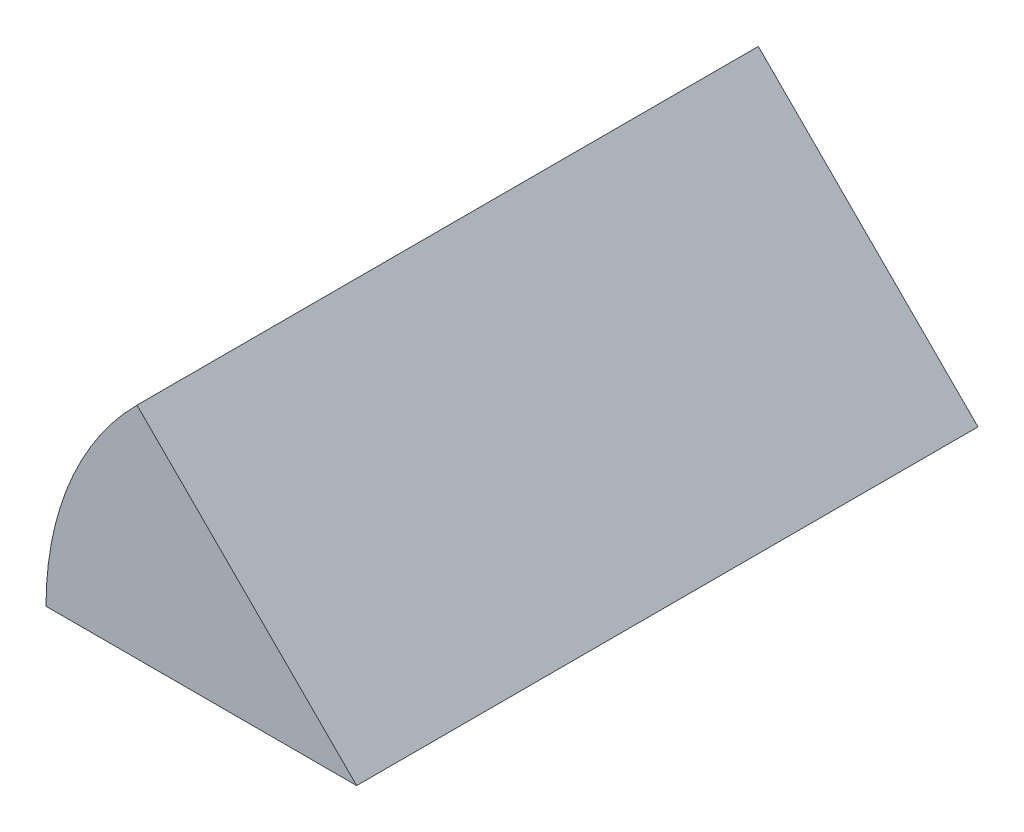
ISO-10303-21;
HEADER;
FILE_DESCRIPTION(('STEP AP214'),'2;1');
FILE_NAME('part.step','',(''),(''),'','','');
FILE_SCHEMA(('AUTOMOTIVE_DESIGN { 1 0 10303 214 1 1 1 1 }'));
ENDSEC;
DATA;
#1=APPLICATION_CONTEXT('core data for automotive mechanical design processes');
#2=APPLICATION_PROTOCOL_DEFINITION('international standard','automotive_design',2000,#1);
#3=PRODUCT_CONTEXT('',#1,'mechanical');
#4=PRODUCT('Part','Part','',(#3));
#5=PRODUCT_RELATED_PRODUCT_CATEGORY('part','',(#4));
#6=PRODUCT_DEFINITION_FORMATION('','',#4);
#7=PRODUCT_DEFINITION_CONTEXT('part definition',#1,'design');
#8=PRODUCT_DEFINITION('design','',#6,#7);
#9=PRODUCT_DEFINITION_SHAPE('','',#8);
#10=(LENGTH_UNIT() NAMED_UNIT(*) SI_UNIT(.MILLI.,.METRE.));
#11=(NAMED_UNIT(*) PLANE_ANGLE_UNIT() SI_UNIT($,.RADIAN.));
#12=(NAMED_UNIT(*) SI_UNIT($,.STERADIAN.) SOLID_ANGLE_UNIT());
#13=UNCERTAINTY_MEASURE_WITH_UNIT(LENGTH_MEASURE(1.E-05),#10,'distance_accuracy_value','');
#14=(GEOMETRIC_REPRESENTATION_CONTEXT(3) GLOBAL_UNCERTAINTY_ASSIGNED_CONTEXT((#13)) GLOBAL_UNIT_ASSIGNED_CONTEXT((#10,
#11,#12)) REPRESENTATION_CONTEXT('',''));
#15=CARTESIAN_POINT('',(0.,0.,0.));
#16=DIRECTION('',(0.,0.,1.));
#17=DIRECTION('',(1.,0.,0.));
#18=AXIS2_PLACEMENT_3D('',#15,#16,#17);
#19=CARTESIAN_POINT('',(0.,0.,50.));
#20=DIRECTION('',(-0.707106781186544,-0.707106781186551,0.));
#21=DIRECTION('',(0.707106781186551,-0.707106781186544,0.));
#22=AXIS2_PLACEMENT_3D('',#19,#20,#21);
#23=PLANE('',#22);
#24=DIRECTION('',(-0.707106781186551,0.707106781186544,0.));
#25=VECTOR('',#24,1.);
#26=CARTESIAN_POINT('',(0.,0.,0.));
#27=LINE('',#26,#25);
#28=CARTESIAN_POINT('',(0.,0.,0.));
#29=VERTEX_POINT('',#28);
#30=CARTESIAN_POINT('',(-17.6776695296638,17.6776695296636,0.));
#31=VERTEX_POINT('',#30);
#32=EDGE_CURVE('E80',#29,#31,#27,.T.);
#33=ORIENTED_EDGE('',*,*,#32,.T.);
#34=DIRECTION('',(0.,0.,-1.));
#35=VECTOR('',#34,1.);
#36=CARTESIAN_POINT('',(-17.6776695296638,17.6776695296636,50.));
#37=LINE('',#36,#35);
#38=CARTESIAN_POINT('',(-17.6776695296638,17.6776695296636,50.));
#39=VERTEX_POINT('',#38);
#40=EDGE_CURVE('E11',#39,#31,#37,.T.);
#41=ORIENTED_EDGE('',*,*,#40,.F.);
#42=DIRECTION('',(-0.707106781186551,0.707106781186544,0.));
#43=VECTOR('',#42,1.);
#44=CARTESIAN_POINT('',(0.,0.,50.));
#45=LINE('',#44,#43);
#46=CARTESIAN_POINT('',(0.,0.,50.));
#47=VERTEX_POINT('',#46);
#48=EDGE_CURVE('E73',#47,#39,#45,.T.);
#49=ORIENTED_EDGE('',*,*,#48,.F.);
#50=DIRECTION('',(0.,0.,-1.));
#51=VECTOR('',#50,1.);
#52=CARTESIAN_POINT('',(0.,0.,50.));
#53=LINE('',#52,#51);
#54=EDGE_CURVE('E81',#47,#29,#53,.T.);
#55=ORIENTED_EDGE('',*,*,#54,.T.);
#56=EDGE_LOOP('',(#33,#41,#49,#55));
#57=FACE_BOUND('',#56,.T.);
#58=ADVANCED_FACE('F33',(#57),#23,.F.);
#59=CARTESIAN_POINT('',(0.,0.,50.));
#60=DIRECTION('',(0.,0.,-1.));
#61=DIRECTION('',(-1.,0.,0.));
#62=AXIS2_PLACEMENT_3D('',#59,#60,#61);
#63=CYLINDRICAL_SURFACE('',#62,25.);
#64=CARTESIAN_POINT('',(0.,0.,0.));
#65=DIRECTION('',(0.,0.,1.));
#66=DIRECTION('',(1.,0.,0.));
#67=AXIS2_PLACEMENT_3D('',#64,#65,#66);
#68=CIRCLE('',#67,25.);
#69=CARTESIAN_POINT('',(-25.,0.,0.));
#70=VERTEX_POINT('',#69);
#71=EDGE_CURVE('E61',#31,#70,#68,.T.);
#72=ORIENTED_EDGE('',*,*,#71,.T.);
#73=DIRECTION('',(0.,0.,-1.));
#74=VECTOR('',#73,1.);
#75=CARTESIAN_POINT('',(-25.,0.,50.));
#76=LINE('',#75,#74);
#77=CARTESIAN_POINT('',(-25.,0.,50.));
#78=VERTEX_POINT('',#77);
#79=EDGE_CURVE('E41',#78,#70,#76,.T.);
#80=ORIENTED_EDGE('',*,*,#79,.F.);
#81=CARTESIAN_POINT('',(0.,0.,50.));
#82=DIRECTION('',(0.,0.,1.));
#83=DIRECTION('',(1.,0.,0.));
#84=AXIS2_PLACEMENT_3D('',#81,#82,#83);
#85=CIRCLE('',#84,25.);
#86=EDGE_CURVE('E69',#39,#78,#85,.T.);
#87=ORIENTED_EDGE('',*,*,#86,.F.);
#88=ORIENTED_EDGE('',*,*,#40,.T.);
#89=EDGE_LOOP('',(#72,#80,#87,#88));
#90=FACE_BOUND('',#89,.T.);
#91=ADVANCED_FACE('F70',(#90),#63,.T.);
#92=CARTESIAN_POINT('',(-25.,0.,50.));
#93=DIRECTION('',(0.,1.,0.));
#94=DIRECTION('',(0.,0.,1.));
#95=AXIS2_PLACEMENT_3D('',#92,#93,#94);
#96=PLANE('',#95);
#97=DIRECTION('',(1.,0.,0.));
#98=VECTOR('',#97,1.);
#99=CARTESIAN_POINT('',(-25.,0.,0.));
#100=LINE('',#99,#98);
#101=EDGE_CURVE('E66',#70,#29,#100,.T.);
#102=ORIENTED_EDGE('',*,*,#101,.T.);
#103=ORIENTED_EDGE('',*,*,#54,.F.);
#104=DIRECTION('',(1.,0.,0.));
#105=VECTOR('',#104,1.);
#106=CARTESIAN_POINT('',(-25.,0.,50.));
#107=LINE('',#106,#105);
#108=EDGE_CURVE('E49',#78,#47,#107,.T.);
#109=ORIENTED_EDGE('',*,*,#108,.F.);
#110=ORIENTED_EDGE('',*,*,#79,.T.);
#111=EDGE_LOOP('',(#102,#103,#109,#110));
#112=FACE_BOUND('',#111,.T.);
#113=ADVANCED_FACE('F92',(#112),#96,.F.);
#114=CARTESIAN_POINT('',(0.,0.,50.));
#115=DIRECTION('',(0.,0.,1.));
#116=DIRECTION('',(1.,0.,0.));
#117=AXIS2_PLACEMENT_3D('',#114,#115,#116);
#118=PLANE('',#117);
#119=ORIENTED_EDGE('',*,*,#48,.T.);
#120=ORIENTED_EDGE('',*,*,#86,.T.);
#121=ORIENTED_EDGE('',*,*,#108,.T.);
#122=EDGE_LOOP('',(#119,#120,#121));
#123=FACE_BOUND('',#122,.T.);
#124=ADVANCED_FACE('F76',(#123),#118,.T.);
#125=CARTESIAN_POINT('',(0.,0.,0.));
#126=DIRECTION('',(0.,0.,1.));
#127=DIRECTION('',(1.,0.,0.));
#128=AXIS2_PLACEMENT_3D('',#125,#126,#127);
#129=PLANE('',#128);
#130=CARTESIAN_POINT('',(-16.4977236145594,6.47253512533171,0.));
#131=DIRECTION('',(0.,0.,-1.));
#132=DIRECTION('',(-1.,0.,0.));
#133=AXIS2_PLACEMENT_3D('',#130,#131,#132);
#134=CIRCLE('',#133,5.);
#135=CARTESIAN_POINT('',(-21.4977236145594,6.47253512533171,0.));
#136=VERTEX_POINT('',#135);
#137=EDGE_CURVE('E87',#136,#136,#134,.T.);
#138=ORIENTED_EDGE('',*,*,#137,.F.);
#139=EDGE_LOOP('',(#138));
#140=FACE_BOUND('',#139,.T.);
#141=ORIENTED_EDGE('',*,*,#32,.F.);
#142=ORIENTED_EDGE('',*,*,#101,.F.);
#143=ORIENTED_EDGE('',*,*,#71,.F.);
#144=EDGE_LOOP('',(#141,#142,#143));
#145=FACE_BOUND('',#144,.T.);
#146=ADVANCED_FACE('F93',(#140,#145),#129,.F.);
#147=CARTESIAN_POINT('',(-16.4977236145594,6.47253512533171,10.));
#148=DIRECTION('',(0.,0.,-1.));
#149=DIRECTION('',(-1.,0.,0.));
#150=AXIS2_PLACEMENT_3D('',#147,#148,#149);
#151=CYLINDRICAL_SURFACE('',#150,5.);
#152=CARTESIAN_POINT('',(-16.4977236145594,6.47253512533171,10.));
#153=DIRECTION('',(0.,0.,-1.));
#154=DIRECTION('',(-1.,0.,0.));
#155=AXIS2_PLACEMENT_3D('',#152,#153,#154);
#156=CIRCLE('',#155,5.);
#157=CARTESIAN_POINT('',(-21.4977236145594,6.47253512533171,10.));
#158=VERTEX_POINT('',#157);
#159=EDGE_CURVE('E83',#158,#158,#156,.T.);
#160=ORIENTED_EDGE('',*,*,#159,.F.);
#161=EDGE_LOOP('',(#160));
#162=FACE_BOUND('',#161,.T.);
#163=ORIENTED_EDGE('',*,*,#137,.T.);
#164=EDGE_LOOP('',(#163));
#165=FACE_BOUND('',#164,.T.);
#166=ADVANCED_FACE('F95',(#162,#165),#151,.F.);
#167=CARTESIAN_POINT('',(-16.4977236145594,6.47253512533171,10.));
#168=DIRECTION('',(0.,0.,-1.));
#169=DIRECTION('',(-1.,0.,0.));
#170=AXIS2_PLACEMENT_3D('',#167,#168,#169);
#171=PLANE('',#170);
#172=ORIENTED_EDGE('',*,*,#159,.T.);
#173=EDGE_LOOP('',(#172));
#174=FACE_BOUND('',#173,.T.);
#175=ADVANCED_FACE('F102',(#174),#171,.T.);
#176=CLOSED_SHELL('',(#58,#91,#113,#124,#146,#166,#175));
#177=MANIFOLD_SOLID_BREP('B2',#176);
#178=ADVANCED_BREP_SHAPE_REPRESENTATION('',(#18,#177),#14);
#179=SHAPE_DEFINITION_REPRESENTATION(#9,#178);
ENDSEC;
END-ISO-10303-21;
